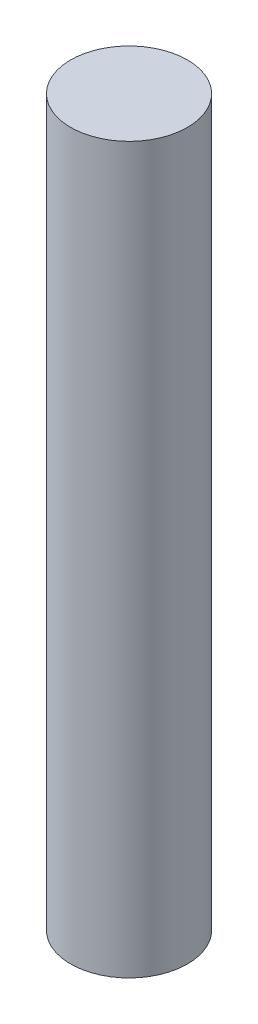
ISO-10303-21;
HEADER;
FILE_DESCRIPTION(('STEP AP214'),'2;1');
FILE_NAME('part.step','',(''),(''),'','','');
FILE_SCHEMA(('AUTOMOTIVE_DESIGN { 1 0 10303 214 1 1 1 1 }'));
ENDSEC;
DATA;
#1=APPLICATION_CONTEXT('core data for automotive mechanical design processes');
#2=APPLICATION_PROTOCOL_DEFINITION('international standard','automotive_design',2000,#1);
#3=PRODUCT_CONTEXT('',#1,'mechanical');
#4=PRODUCT('Part','Part','',(#3));
#5=PRODUCT_RELATED_PRODUCT_CATEGORY('part','',(#4));
#6=PRODUCT_DEFINITION_FORMATION('','',#4);
#7=PRODUCT_DEFINITION_CONTEXT('part definition',#1,'design');
#8=PRODUCT_DEFINITION('design','',#6,#7);
#9=PRODUCT_DEFINITION_SHAPE('','',#8);
#10=(LENGTH_UNIT() NAMED_UNIT(*) SI_UNIT(.MILLI.,.METRE.));
#11=(NAMED_UNIT(*) PLANE_ANGLE_UNIT() SI_UNIT($,.RADIAN.));
#12=(NAMED_UNIT(*) SI_UNIT($,.STERADIAN.) SOLID_ANGLE_UNIT());
#13=UNCERTAINTY_MEASURE_WITH_UNIT(LENGTH_MEASURE(1.E-05),#10,'distance_accuracy_value','');
#14=(GEOMETRIC_REPRESENTATION_CONTEXT(3) GLOBAL_UNCERTAINTY_ASSIGNED_CONTEXT((#13)) GLOBAL_UNIT_ASSIGNED_CONTEXT((#10,
#11,#12)) REPRESENTATION_CONTEXT('',''));
#15=CARTESIAN_POINT('',(0.,0.,0.));
#16=DIRECTION('',(0.,0.,1.));
#17=DIRECTION('',(1.,0.,0.));
#18=AXIS2_PLACEMENT_3D('',#15,#16,#17);
#19=CARTESIAN_POINT('',(0.,31.,0.));
#20=DIRECTION('',(0.,1.,0.));
#21=DIRECTION('',(0.,0.,1.));
#22=AXIS2_PLACEMENT_3D('',#19,#20,#21);
#23=PLANE('',#22);
#24=CARTESIAN_POINT('',(0.,31.,0.));
#25=DIRECTION('',(0.,-1.,0.));
#26=DIRECTION('',(0.,0.,-1.));
#27=AXIS2_PLACEMENT_3D('',#24,#25,#26);
#28=CIRCLE('',#27,2.5);
#29=CARTESIAN_POINT('',(0.,31.,-2.5));
#30=VERTEX_POINT('',#29);
#31=EDGE_CURVE('E18',#30,#30,#28,.T.);
#32=ORIENTED_EDGE('',*,*,#31,.F.);
#33=EDGE_LOOP('',(#32));
#34=FACE_BOUND('',#33,.T.);
#35=ADVANCED_FACE('F15',(#34),#23,.T.);
#36=CARTESIAN_POINT('',(0.,0.,0.));
#37=DIRECTION('',(0.,1.,0.));
#38=DIRECTION('',(0.,0.,1.));
#39=AXIS2_PLACEMENT_3D('',#36,#37,#38);
#40=PLANE('',#39);
#41=CARTESIAN_POINT('',(0.,0.,0.));
#42=DIRECTION('',(0.,-1.,0.));
#43=DIRECTION('',(0.,0.,-1.));
#44=AXIS2_PLACEMENT_3D('',#41,#42,#43);
#45=CIRCLE('',#44,2.5);
#46=CARTESIAN_POINT('',(0.,0.,-2.5));
#47=VERTEX_POINT('',#46);
#48=EDGE_CURVE('E10',#47,#47,#45,.F.);
#49=ORIENTED_EDGE('',*,*,#48,.F.);
#50=EDGE_LOOP('',(#49));
#51=FACE_BOUND('',#50,.T.);
#52=ADVANCED_FACE('F30',(#51),#40,.F.);
#53=CARTESIAN_POINT('',(0.,31.,0.));
#54=DIRECTION('',(0.,-1.,0.));
#55=DIRECTION('',(0.,0.,-1.));
#56=AXIS2_PLACEMENT_3D('',#53,#54,#55);
#57=CYLINDRICAL_SURFACE('',#56,2.5);
#58=ORIENTED_EDGE('',*,*,#48,.T.);
#59=EDGE_LOOP('',(#58));
#60=FACE_BOUND('',#59,.T.);
#61=ORIENTED_EDGE('',*,*,#31,.T.);
#62=EDGE_LOOP('',(#61));
#63=FACE_BOUND('',#62,.T.);
#64=ADVANCED_FACE('F27',(#60,#63),#57,.T.);
#65=CLOSED_SHELL('',(#35,#52,#64));
#66=MANIFOLD_SOLID_BREP('B1',#65);
#67=ADVANCED_BREP_SHAPE_REPRESENTATION('',(#18,#66),#14);
#68=SHAPE_DEFINITION_REPRESENTATION(#9,#67);
ENDSEC;
END-ISO-10303-21;
